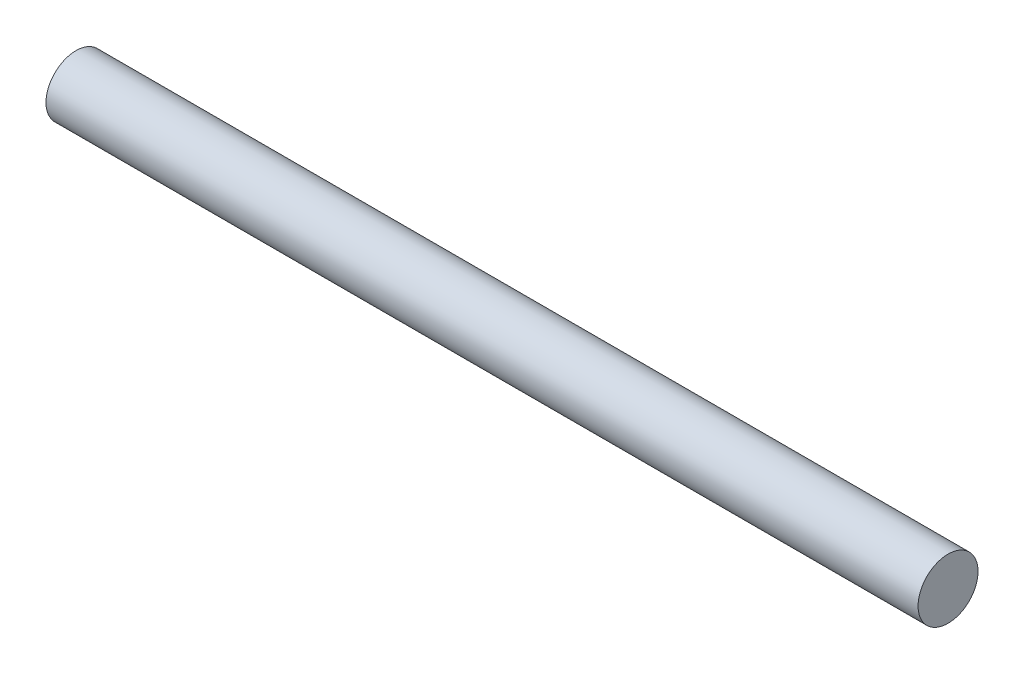
ISO-10303-21;
HEADER;
FILE_DESCRIPTION(('STEP AP214'),'2;1');
FILE_NAME('part.step','',(''),(''),'','','');
FILE_SCHEMA(('AUTOMOTIVE_DESIGN { 1 0 10303 214 1 1 1 1 }'));
ENDSEC;
DATA;
#1=APPLICATION_CONTEXT('core data for automotive mechanical design processes');
#2=APPLICATION_PROTOCOL_DEFINITION('international standard','automotive_design',2000,#1);
#3=PRODUCT_CONTEXT('',#1,'mechanical');
#4=PRODUCT('Part','Part','',(#3));
#5=PRODUCT_RELATED_PRODUCT_CATEGORY('part','',(#4));
#6=PRODUCT_DEFINITION_FORMATION('','',#4);
#7=PRODUCT_DEFINITION_CONTEXT('part definition',#1,'design');
#8=PRODUCT_DEFINITION('design','',#6,#7);
#9=PRODUCT_DEFINITION_SHAPE('','',#8);
#10=(LENGTH_UNIT() NAMED_UNIT(*) SI_UNIT(.MILLI.,.METRE.));
#11=(NAMED_UNIT(*) PLANE_ANGLE_UNIT() SI_UNIT($,.RADIAN.));
#12=(NAMED_UNIT(*) SI_UNIT($,.STERADIAN.) SOLID_ANGLE_UNIT());
#13=UNCERTAINTY_MEASURE_WITH_UNIT(LENGTH_MEASURE(1.E-05),#10,'distance_accuracy_value','');
#14=(GEOMETRIC_REPRESENTATION_CONTEXT(3) GLOBAL_UNCERTAINTY_ASSIGNED_CONTEXT((#13)) GLOBAL_UNIT_ASSIGNED_CONTEXT((#10,
#11,#12)) REPRESENTATION_CONTEXT('',''));
#15=CARTESIAN_POINT('',(0.,0.,0.));
#16=DIRECTION('',(0.,0.,1.));
#17=DIRECTION('',(1.,0.,0.));
#18=AXIS2_PLACEMENT_3D('',#15,#16,#17);
#19=CARTESIAN_POINT('',(29.,0.,0.));
#20=DIRECTION('',(-1.,0.,0.));
#21=DIRECTION('',(0.,0.,1.));
#22=AXIS2_PLACEMENT_3D('',#19,#20,#21);
#23=CYLINDRICAL_SURFACE('',#22,0.9975);
#24=CARTESIAN_POINT('',(29.,0.,0.));
#25=DIRECTION('',(1.,0.,0.));
#26=DIRECTION('',(0.,0.,-1.));
#27=AXIS2_PLACEMENT_3D('',#24,#25,#26);
#28=CIRCLE('',#27,0.9975);
#29=CARTESIAN_POINT('',(29.,0.,0.9975));
#30=VERTEX_POINT('',#29);
#31=EDGE_CURVE('E12',#30,#30,#28,.T.);
#32=CARTESIAN_POINT('',(0.,0.,0.));
#33=DIRECTION('',(1.,0.,0.));
#34=DIRECTION('',(0.,0.,-1.));
#35=AXIS2_PLACEMENT_3D('',#32,#33,#34);
#36=CIRCLE('',#35,0.9975);
#37=CARTESIAN_POINT('',(0.,0.,0.9975));
#38=VERTEX_POINT('',#37);
#39=EDGE_CURVE('E44',#38,#38,#36,.T.);
#40=CARTESIAN_POINT('',(29.,0.,0.9975));
#41=CARTESIAN_POINT('',(28.6979166666667,0.,0.9975));
#42=CARTESIAN_POINT('',(28.3958333333333,0.,0.9975));
#43=CARTESIAN_POINT('',(27.7916666666667,0.,0.9975));
#44=CARTESIAN_POINT('',(27.4895833333333,0.,0.9975));
#45=CARTESIAN_POINT('',(26.8854166666667,0.,0.9975));
#46=CARTESIAN_POINT('',(26.5833333333333,0.,0.9975));
#47=CARTESIAN_POINT('',(25.9791666666667,0.,0.9975));
#48=CARTESIAN_POINT('',(25.6770833333333,0.,0.9975));
#49=CARTESIAN_POINT('',(25.0729166666667,0.,0.9975));
#50=CARTESIAN_POINT('',(24.7708333333333,0.,0.9975));
#51=CARTESIAN_POINT('',(24.1666666666667,0.,0.9975));
#52=CARTESIAN_POINT('',(23.8645833333333,0.,0.9975));
#53=CARTESIAN_POINT('',(23.2604166666667,0.,0.9975));
#54=CARTESIAN_POINT('',(22.9583333333333,0.,0.9975));
#55=CARTESIAN_POINT('',(22.3541666666667,0.,0.9975));
#56=CARTESIAN_POINT('',(22.0520833333333,0.,0.9975));
#57=CARTESIAN_POINT('',(21.4479166666667,0.,0.9975));
#58=CARTESIAN_POINT('',(21.1458333333333,0.,0.9975));
#59=CARTESIAN_POINT('',(20.5416666666667,0.,0.9975));
#60=CARTESIAN_POINT('',(20.2395833333333,0.,0.9975));
#61=CARTESIAN_POINT('',(19.6354166666667,0.,0.9975));
#62=CARTESIAN_POINT('',(19.3333333333333,0.,0.9975));
#63=CARTESIAN_POINT('',(18.7291666666667,0.,0.9975));
#64=CARTESIAN_POINT('',(18.4270833333333,0.,0.9975));
#65=CARTESIAN_POINT('',(17.8229166666667,0.,0.9975));
#66=CARTESIAN_POINT('',(17.5208333333333,0.,0.9975));
#67=CARTESIAN_POINT('',(16.9166666666667,0.,0.9975));
#68=CARTESIAN_POINT('',(16.6145833333333,0.,0.9975));
#69=CARTESIAN_POINT('',(16.0104166666667,0.,0.9975));
#70=CARTESIAN_POINT('',(15.7083333333333,0.,0.9975));
#71=CARTESIAN_POINT('',(15.1041666666667,0.,0.9975));
#72=CARTESIAN_POINT('',(14.8020833333333,0.,0.9975));
#73=CARTESIAN_POINT('',(14.1979166666667,0.,0.9975));
#74=CARTESIAN_POINT('',(13.8958333333333,0.,0.9975));
#75=CARTESIAN_POINT('',(13.2916666666667,0.,0.9975));
#76=CARTESIAN_POINT('',(12.9895833333333,0.,0.9975));
#77=CARTESIAN_POINT('',(12.3854166666667,0.,0.9975));
#78=CARTESIAN_POINT('',(12.0833333333333,0.,0.9975));
#79=CARTESIAN_POINT('',(11.4791666666667,0.,0.9975));
#80=CARTESIAN_POINT('',(11.1770833333333,0.,0.9975));
#81=CARTESIAN_POINT('',(10.5729166666667,0.,0.9975));
#82=CARTESIAN_POINT('',(10.2708333333333,0.,0.9975));
#83=CARTESIAN_POINT('',(9.66666666666667,0.,0.9975));
#84=CARTESIAN_POINT('',(9.36458333333333,0.,0.9975));
#85=CARTESIAN_POINT('',(8.76041666666667,0.,0.9975));
#86=CARTESIAN_POINT('',(8.45833333333333,0.,0.9975));
#87=CARTESIAN_POINT('',(7.85416666666667,0.,0.9975));
#88=CARTESIAN_POINT('',(7.55208333333333,0.,0.9975));
#89=CARTESIAN_POINT('',(6.94791666666667,0.,0.9975));
#90=CARTESIAN_POINT('',(6.64583333333333,0.,0.9975));
#91=CARTESIAN_POINT('',(6.04166666666667,0.,0.9975));
#92=CARTESIAN_POINT('',(5.73958333333333,0.,0.9975));
#93=CARTESIAN_POINT('',(5.13541666666667,0.,0.9975));
#94=CARTESIAN_POINT('',(4.83333333333333,0.,0.9975));
#95=CARTESIAN_POINT('',(4.22916666666667,0.,0.9975));
#96=CARTESIAN_POINT('',(3.92708333333333,0.,0.9975));
#97=CARTESIAN_POINT('',(3.32291666666667,0.,0.9975));
#98=CARTESIAN_POINT('',(3.02083333333333,0.,0.9975));
#99=CARTESIAN_POINT('',(2.41666666666667,0.,0.9975));
#100=CARTESIAN_POINT('',(2.11458333333333,0.,0.9975));
#101=CARTESIAN_POINT('',(1.51041666666667,0.,0.9975));
#102=CARTESIAN_POINT('',(1.20833333333333,0.,0.9975));
#103=CARTESIAN_POINT('',(0.604166666666667,0.,0.9975));
#104=CARTESIAN_POINT('',(0.302083333333333,0.,0.9975));
#105=CARTESIAN_POINT('',(0.,0.,0.9975));
#106=B_SPLINE_CURVE_WITH_KNOTS('',3,(#40,#41,#42,#43,#44,#45,#46,#47,#48,#49,#50,#51,#52,#53,
#54,#55,#56,#57,#58,#59,#60,#61,#62,#63,#64,#65,#66,#67,#68,#69,#70,#71,#72,#73,#74,#75,#76,#77,
#78,#79,#80,#81,#82,#83,#84,#85,#86,#87,#88,#89,#90,#91,#92,#93,#94,#95,#96,#97,#98,#99,#100,
#101,#102,#103,#104,#105),.UNSPECIFIED.,.F.,.F.,(4,2,2,2,2,2,2,2,2,2,2,2,2,2,2,2,2,2,2,2,2,2,2,
2,2,2,2,2,2,2,2,2,4),(0.,0.906249999999997,1.8125,2.71875,3.625,4.53125,5.4375,6.34375,7.25,
8.15625,9.0625,9.96875,10.875,11.78125,12.6875,13.59375,14.5,15.40625,16.3125,17.21875,18.125,
19.03125,19.9375,20.84375,21.75,22.65625,23.5625,24.46875,25.375,26.28125,27.1875,28.09375,29.),.UNSPECIFIED.);
#107=EDGE_CURVE('BSEAM41',#30,#38,#106,.T.);
#108=ORIENTED_EDGE('',*,*,#31,.F.);
#109=ORIENTED_EDGE('',*,*,#39,.T.);
#110=ORIENTED_EDGE('',*,*,#107,.T.);
#111=ORIENTED_EDGE('',*,*,#107,.F.);
#112=EDGE_LOOP('',(#108,#110,#109,#111));
#113=FACE_BOUND('',#112,.T.);
#114=ADVANCED_FACE('F41',(#113),#23,.T.);
#115=CARTESIAN_POINT('',(29.,0.,0.));
#116=DIRECTION('',(1.,0.,0.));
#117=DIRECTION('',(0.,0.,-1.));
#118=AXIS2_PLACEMENT_3D('',#115,#116,#117);
#119=PLANE('',#118);
#120=ORIENTED_EDGE('',*,*,#31,.T.);
#121=EDGE_LOOP('',(#120));
#122=FACE_BOUND('',#121,.T.);
#123=ADVANCED_FACE('F56',(#122),#119,.T.);
#124=CARTESIAN_POINT('',(0.,0.,0.));
#125=DIRECTION('',(1.,0.,0.));
#126=DIRECTION('',(0.,0.,-1.));
#127=AXIS2_PLACEMENT_3D('',#124,#125,#126);
#128=PLANE('',#127);
#129=ORIENTED_EDGE('',*,*,#39,.F.);
#130=EDGE_LOOP('',(#129));
#131=FACE_BOUND('',#130,.T.);
#132=ADVANCED_FACE('F54',(#131),#128,.F.);
#133=CLOSED_SHELL('',(#114,#123,#132));
#134=MANIFOLD_SOLID_BREP('B2',#133);
#135=ADVANCED_BREP_SHAPE_REPRESENTATION('',(#18,#134),#14);
#136=SHAPE_DEFINITION_REPRESENTATION(#9,#135);
ENDSEC;
END-ISO-10303-21;
